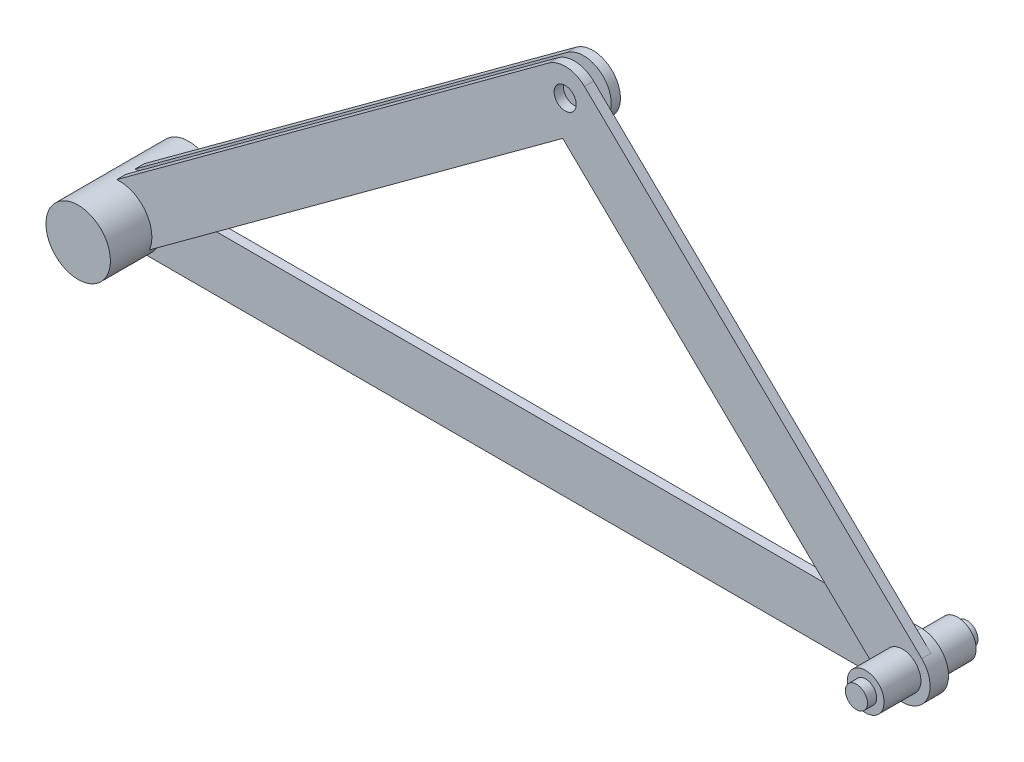
ISO-10303-21;
HEADER;
FILE_DESCRIPTION(('STEP AP214'),'2;1');
FILE_NAME('part.step','',(''),(''),'','','');
FILE_SCHEMA(('AUTOMOTIVE_DESIGN { 1 0 10303 214 1 1 1 1 }'));
ENDSEC;
DATA;
#1=APPLICATION_CONTEXT('core data for automotive mechanical design processes');
#2=APPLICATION_PROTOCOL_DEFINITION('international standard','automotive_design',2000,#1);
#3=PRODUCT_CONTEXT('',#1,'mechanical');
#4=PRODUCT('Part','Part','',(#3));
#5=PRODUCT_RELATED_PRODUCT_CATEGORY('part','',(#4));
#6=PRODUCT_DEFINITION_FORMATION('','',#4);
#7=PRODUCT_DEFINITION_CONTEXT('part definition',#1,'design');
#8=PRODUCT_DEFINITION('design','',#6,#7);
#9=PRODUCT_DEFINITION_SHAPE('','',#8);
#10=(LENGTH_UNIT() NAMED_UNIT(*) SI_UNIT(.MILLI.,.METRE.));
#11=(NAMED_UNIT(*) PLANE_ANGLE_UNIT() SI_UNIT($,.RADIAN.));
#12=(NAMED_UNIT(*) SI_UNIT($,.STERADIAN.) SOLID_ANGLE_UNIT());
#13=UNCERTAINTY_MEASURE_WITH_UNIT(LENGTH_MEASURE(1.E-05),#10,'distance_accuracy_value','');
#14=(GEOMETRIC_REPRESENTATION_CONTEXT(3) GLOBAL_UNCERTAINTY_ASSIGNED_CONTEXT((#13)) GLOBAL_UNIT_ASSIGNED_CONTEXT((#10,
#11,#12)) REPRESENTATION_CONTEXT('',''));
#15=CARTESIAN_POINT('',(0.,0.,0.));
#16=DIRECTION('',(0.,0.,1.));
#17=DIRECTION('',(1.,0.,0.));
#18=AXIS2_PLACEMENT_3D('',#15,#16,#17);
#19=CARTESIAN_POINT('',(0.,0.,5.));
#20=DIRECTION('',(0.,0.,1.));
#21=DIRECTION('',(1.,0.,0.));
#22=AXIS2_PLACEMENT_3D('',#19,#20,#21);
#23=PLANE('',#22);
#24=CARTESIAN_POINT('',(-215.,0.,5.));
#25=DIRECTION('',(0.,0.,1.));
#26=DIRECTION('',(1.,0.,0.));
#27=AXIS2_PLACEMENT_3D('',#24,#25,#26);
#28=CIRCLE('',#27,17.5);
#29=CARTESIAN_POINT('',(-205.98612181134,-15.,5.));
#30=VERTEX_POINT('',#29);
#31=CARTESIAN_POINT('',(-198.859216412014,-6.76203409972145,5.));
#32=VERTEX_POINT('',#31);
#33=EDGE_CURVE('E57',#30,#32,#28,.T.);
#34=ORIENTED_EDGE('',*,*,#33,.F.);
#35=DIRECTION('',(1.,0.,0.));
#36=VECTOR('',#35,1.);
#37=CARTESIAN_POINT('',(-225.,-15.,5.));
#38=LINE('',#37,#36);
#39=CARTESIAN_POINT('',(210.,-15.,5.));
#40=VERTEX_POINT('',#39);
#41=EDGE_CURVE('E315',#30,#40,#38,.T.);
#42=ORIENTED_EDGE('',*,*,#41,.T.);
#43=CARTESIAN_POINT('',(210.,0.,5.));
#44=DIRECTION('',(0.,0.,1.));
#45=DIRECTION('',(1.,0.,0.));
#46=AXIS2_PLACEMENT_3D('',#43,#44,#45);
#47=CIRCLE('',#46,15.);
#48=CARTESIAN_POINT('',(199.561031329421,-10.7716262975779,5.));
#49=VERTEX_POINT('',#48);
#50=EDGE_CURVE('E271',#49,#40,#47,.T.);
#51=ORIENTED_EDGE('',*,*,#50,.F.);
#52=DIRECTION('',(0.718108419838523,-0.695931244705265,0.));
#53=VECTOR('',#52,1.);
#54=CARTESIAN_POINT('',(199.561031329421,-10.7716262975779,5.));
#55=LINE('',#54,#53);
#56=CARTESIAN_POINT('',(172.968143054861,15.,5.));
#57=VERTEX_POINT('',#56);
#58=EDGE_CURVE('E292',#57,#49,#55,.T.);
#59=ORIENTED_EDGE('',*,*,#58,.F.);
#60=DIRECTION('',(-1.,0.,0.));
#61=VECTOR('',#60,1.);
#62=CARTESIAN_POINT('',(-225.,15.,5.));
#63=LINE('',#62,#61);
#64=CARTESIAN_POINT('',(-169.19744009417,15.,5.));
#65=VERTEX_POINT('',#64);
#66=EDGE_CURVE('E316',#57,#65,#63,.T.);
#67=ORIENTED_EDGE('',*,*,#66,.T.);
#68=DIRECTION('',(0.806274509803921,0.591541557999475,0.));
#69=VECTOR('',#68,1.);
#70=CARTESIAN_POINT('',(-206.126876630008,-12.0941176470588,5.));
#71=LINE('',#70,#69);
#72=EDGE_CURVE('E258',#32,#65,#71,.T.);
#73=ORIENTED_EDGE('',*,*,#72,.F.);
#74=EDGE_LOOP('',(#34,#42,#51,#59,#67,#73));
#75=FACE_BOUND('',#74,.T.);
#76=ADVANCED_FACE('F40',(#75),#23,.T.);
#77=CARTESIAN_POINT('',(26.8823529411766,177.462467399842,10.));
#78=DIRECTION('',(0.,0.,-1.));
#79=DIRECTION('',(-1.,0.,0.));
#80=AXIS2_PLACEMENT_3D('',#77,#78,#79);
#81=CYLINDRICAL_SURFACE('',#80,15.);
#82=DIRECTION('',(0.,0.,-1.));
#83=VECTOR('',#82,1.);
#84=CARTESIAN_POINT('',(18.0092295711844,189.556585046901,10.));
#85=LINE('',#84,#83);
#86=CARTESIAN_POINT('',(18.0092295711844,189.556585046901,10.));
#87=VERTEX_POINT('',#86);
#88=CARTESIAN_POINT('',(18.0092295711844,189.556585046901,5.));
#89=VERTEX_POINT('',#88);
#90=EDGE_CURVE('E257',#87,#89,#85,.T.);
#91=ORIENTED_EDGE('',*,*,#90,.F.);
#92=CARTESIAN_POINT('',(26.8823529411766,177.462467399842,10.));
#93=DIRECTION('',(0.,0.,1.));
#94=DIRECTION('',(1.,0.,0.));
#95=AXIS2_PLACEMENT_3D('',#92,#93,#94);
#96=CIRCLE('',#95,15.);
#97=CARTESIAN_POINT('',(37.3213216117556,188.23409369742,10.));
#98=VERTEX_POINT('',#97);
#99=EDGE_CURVE('E280',#98,#87,#96,.T.);
#100=ORIENTED_EDGE('',*,*,#99,.F.);
#101=DIRECTION('',(0.,0.,-1.));
#102=VECTOR('',#101,1.);
#103=CARTESIAN_POINT('',(37.3213216117556,188.23409369742,10.));
#104=LINE('',#103,#102);
#105=CARTESIAN_POINT('',(37.3213216117556,188.23409369742,5.));
#106=VERTEX_POINT('',#105);
#107=EDGE_CURVE('E296',#98,#106,#104,.T.);
#108=ORIENTED_EDGE('',*,*,#107,.T.);
#109=CARTESIAN_POINT('',(26.8823529411766,177.462467399842,5.));
#110=DIRECTION('',(0.,0.,1.));
#111=DIRECTION('',(1.,0.,0.));
#112=AXIS2_PLACEMENT_3D('',#109,#110,#111);
#113=CIRCLE('',#112,15.);
#114=EDGE_CURVE('E290',#106,#89,#113,.T.);
#115=ORIENTED_EDGE('',*,*,#114,.T.);
#116=EDGE_LOOP('',(#91,#100,#108,#115));
#117=FACE_BOUND('',#116,.T.);
#118=ADVANCED_FACE('F380',(#117),#81,.T.);
#119=CARTESIAN_POINT('',(199.561031329421,-10.7716262975779,10.));
#120=DIRECTION('',(0.695931244705265,0.718108419838523,0.));
#121=DIRECTION('',(-0.718108419838523,0.695931244705265,0.));
#122=AXIS2_PLACEMENT_3D('',#119,#120,#121);
#123=PLANE('',#122);
#124=DIRECTION('',(0.,0.,1.));
#125=VECTOR('',#124,1.);
#126=CARTESIAN_POINT('',(25.5409513118945,157.874232105725,10.));
#127=LINE('',#126,#125);
#128=CARTESIAN_POINT('',(25.5409513118945,157.874232105725,5.));
#129=VERTEX_POINT('',#128);
#130=CARTESIAN_POINT('',(25.5409513118945,157.874232105725,10.));
#131=VERTEX_POINT('',#130);
#132=EDGE_CURVE('E340',#129,#131,#127,.T.);
#133=ORIENTED_EDGE('',*,*,#132,.F.);
#134=EDGE_CURVE('E278',#129,#57,#55,.T.);
#135=ORIENTED_EDGE('',*,*,#134,.T.);
#136=ORIENTED_EDGE('',*,*,#58,.T.);
#137=DIRECTION('',(0.,0.,-1.));
#138=VECTOR('',#137,1.);
#139=CARTESIAN_POINT('',(199.561031329421,-10.7716262975779,10.));
#140=LINE('',#139,#138);
#141=CARTESIAN_POINT('',(199.561031329421,-10.7716262975779,10.));
#142=VERTEX_POINT('',#141);
#143=EDGE_CURVE('E285',#142,#49,#140,.T.);
#144=ORIENTED_EDGE('',*,*,#143,.F.);
#145=DIRECTION('',(0.718108419838523,-0.695931244705265,0.));
#146=VECTOR('',#145,1.);
#147=CARTESIAN_POINT('',(199.561031329421,-10.7716262975779,10.));
#148=LINE('',#147,#146);
#149=EDGE_CURVE('E283',#131,#142,#148,.T.);
#150=ORIENTED_EDGE('',*,*,#149,.F.);
#151=EDGE_LOOP('',(#133,#135,#136,#144,#150));
#152=FACE_BOUND('',#151,.T.);
#153=ADVANCED_FACE('F386',(#152),#123,.F.);
#154=CARTESIAN_POINT('',(210.,0.,5.));
#155=DIRECTION('',(0.,0.,-1.));
#156=DIRECTION('',(-1.,0.,0.));
#157=AXIS2_PLACEMENT_3D('',#154,#155,#156);
#158=CYLINDRICAL_SURFACE('',#157,15.);
#159=DIRECTION('',(0.,0.,-1.));
#160=VECTOR('',#159,1.);
#161=CARTESIAN_POINT('',(210.,15.,5.));
#162=LINE('',#161,#160);
#163=CARTESIAN_POINT('',(210.,15.,5.));
#164=VERTEX_POINT('',#163);
#165=CARTESIAN_POINT('',(210.,15.,0.));
#166=VERTEX_POINT('',#165);
#167=EDGE_CURVE('E318',#164,#166,#162,.T.);
#168=ORIENTED_EDGE('',*,*,#167,.F.);
#169=CARTESIAN_POINT('',(210.,0.,5.));
#170=DIRECTION('',(0.,0.,1.));
#171=DIRECTION('',(1.,0.,0.));
#172=AXIS2_PLACEMENT_3D('',#169,#170,#171);
#173=CIRCLE('',#172,15.);
#174=CARTESIAN_POINT('',(220.438968670579,10.7716262975779,5.));
#175=VERTEX_POINT('',#174);
#176=EDGE_CURVE('E302',#164,#175,#173,.F.);
#177=ORIENTED_EDGE('',*,*,#176,.T.);
#178=DIRECTION('',(0.,0.,-1.));
#179=VECTOR('',#178,1.);
#180=CARTESIAN_POINT('',(220.438968670579,10.7716262975779,10.));
#181=LINE('',#180,#179);
#182=CARTESIAN_POINT('',(220.438968670579,10.7716262975779,10.));
#183=VERTEX_POINT('',#182);
#184=EDGE_CURVE('E299',#183,#175,#181,.T.);
#185=ORIENTED_EDGE('',*,*,#184,.F.);
#186=CARTESIAN_POINT('',(210.,0.,10.));
#187=DIRECTION('',(0.,0.,1.));
#188=DIRECTION('',(1.,0.,0.));
#189=AXIS2_PLACEMENT_3D('',#186,#187,#188);
#190=CIRCLE('',#189,15.);
#191=EDGE_CURVE('E274',#142,#183,#190,.T.);
#192=ORIENTED_EDGE('',*,*,#191,.F.);
#193=ORIENTED_EDGE('',*,*,#143,.T.);
#194=ORIENTED_EDGE('',*,*,#50,.T.);
#195=DIRECTION('',(0.,0.,-1.));
#196=VECTOR('',#195,1.);
#197=CARTESIAN_POINT('',(210.,-15.,5.));
#198=LINE('',#197,#196);
#199=CARTESIAN_POINT('',(210.,-15.,0.));
#200=VERTEX_POINT('',#199);
#201=EDGE_CURVE('E326',#200,#40,#198,.F.);
#202=ORIENTED_EDGE('',*,*,#201,.F.);
#203=CARTESIAN_POINT('',(210.,0.,0.));
#204=DIRECTION('',(0.,0.,1.));
#205=DIRECTION('',(1.,0.,0.));
#206=AXIS2_PLACEMENT_3D('',#203,#204,#205);
#207=CIRCLE('',#206,15.);
#208=EDGE_CURVE('E329',#166,#200,#207,.F.);
#209=ORIENTED_EDGE('',*,*,#208,.F.);
#210=EDGE_LOOP('',(#168,#177,#185,#192,#193,#194,#202,#209));
#211=FACE_BOUND('',#210,.T.);
#212=ADVANCED_FACE('F43',(#211),#158,.T.);
#213=CARTESIAN_POINT('',(-225.,15.,5.));
#214=DIRECTION('',(0.,-1.,0.));
#215=DIRECTION('',(0.,0.,-1.));
#216=AXIS2_PLACEMENT_3D('',#213,#214,#215);
#217=PLANE('',#216);
#218=DIRECTION('',(1.,0.,0.));
#219=VECTOR('',#218,1.);
#220=CARTESIAN_POINT('',(-225.,15.,0.));
#221=LINE('',#220,#219);
#222=CARTESIAN_POINT('',(-205.98612181134,15.,0.));
#223=VERTEX_POINT('',#222);
#224=CARTESIAN_POINT('',(-169.19744009417,14.9999999999999,0.));
#225=VERTEX_POINT('',#224);
#226=EDGE_CURVE('E248',#223,#225,#221,.T.);
#227=ORIENTED_EDGE('',*,*,#226,.F.);
#228=DIRECTION('',(0.,0.,1.));
#229=VECTOR('',#228,1.);
#230=CARTESIAN_POINT('',(-205.98612181134,15.,-27.5));
#231=LINE('',#230,#229);
#232=CARTESIAN_POINT('',(-205.98612181134,15.,5.));
#233=VERTEX_POINT('',#232);
#234=EDGE_CURVE('E199',#223,#233,#231,.T.);
#235=ORIENTED_EDGE('',*,*,#234,.T.);
#236=DIRECTION('',(-1.,0.,0.));
#237=VECTOR('',#236,1.);
#238=CARTESIAN_POINT('',(-225.,15.,5.));
#239=LINE('',#238,#237);
#240=EDGE_CURVE('E264',#65,#233,#239,.T.);
#241=ORIENTED_EDGE('',*,*,#240,.F.);
#242=ORIENTED_EDGE('',*,*,#66,.F.);
#243=EDGE_CURVE('E312',#164,#57,#63,.T.);
#244=ORIENTED_EDGE('',*,*,#243,.F.);
#245=ORIENTED_EDGE('',*,*,#167,.T.);
#246=DIRECTION('',(-1.,0.,0.));
#247=VECTOR('',#246,1.);
#248=CARTESIAN_POINT('',(-225.,15.,0.));
#249=LINE('',#248,#247);
#250=EDGE_CURVE('E319',#166,#225,#249,.T.);
#251=ORIENTED_EDGE('',*,*,#250,.T.);
#252=EDGE_LOOP('',(#227,#235,#241,#242,#244,#245,#251));
#253=FACE_BOUND('',#252,.T.);
#254=ADVANCED_FACE('F391',(#253),#217,.F.);
#255=CARTESIAN_POINT('',(-225.,-15.,5.));
#256=DIRECTION('',(0.,1.,0.));
#257=DIRECTION('',(0.,0.,1.));
#258=AXIS2_PLACEMENT_3D('',#255,#256,#257);
#259=PLANE('',#258);
#260=ORIENTED_EDGE('',*,*,#41,.F.);
#261=DIRECTION('',(0.,0.,1.));
#262=VECTOR('',#261,1.);
#263=CARTESIAN_POINT('',(-205.98612181134,-15.,-27.5));
#264=LINE('',#263,#262);
#265=CARTESIAN_POINT('',(-205.98612181134,-15.,0.));
#266=VERTEX_POINT('',#265);
#267=EDGE_CURVE('E64',#30,#266,#264,.F.);
#268=ORIENTED_EDGE('',*,*,#267,.T.);
#269=DIRECTION('',(1.,0.,0.));
#270=VECTOR('',#269,1.);
#271=CARTESIAN_POINT('',(-225.,-15.,0.));
#272=LINE('',#271,#270);
#273=EDGE_CURVE('E322',#266,#200,#272,.T.);
#274=ORIENTED_EDGE('',*,*,#273,.T.);
#275=ORIENTED_EDGE('',*,*,#201,.T.);
#276=EDGE_LOOP('',(#260,#268,#274,#275));
#277=FACE_BOUND('',#276,.T.);
#278=ADVANCED_FACE('F370',(#277),#259,.F.);
#279=CARTESIAN_POINT('',(0.,0.,0.));
#280=DIRECTION('',(0.,0.,1.));
#281=DIRECTION('',(1.,0.,0.));
#282=AXIS2_PLACEMENT_3D('',#279,#280,#281);
#283=PLANE('',#282);
#284=CARTESIAN_POINT('',(210.,0.,0.));
#285=DIRECTION('',(0.,0.,1.));
#286=DIRECTION('',(1.,0.,0.));
#287=AXIS2_PLACEMENT_3D('',#284,#285,#286);
#288=CIRCLE('',#287,10.);
#289=CARTESIAN_POINT('',(220.,0.,0.));
#290=VERTEX_POINT('',#289);
#291=EDGE_CURVE('E332',#290,#290,#288,.F.);
#292=ORIENTED_EDGE('',*,*,#291,.F.);
#293=EDGE_LOOP('',(#292));
#294=FACE_BOUND('',#293,.T.);
#295=ORIENTED_EDGE('',*,*,#273,.F.);
#296=CARTESIAN_POINT('',(-215.,0.,0.));
#297=DIRECTION('',(0.,0.,1.));
#298=DIRECTION('',(1.,0.,0.));
#299=AXIS2_PLACEMENT_3D('',#296,#297,#298);
#300=CIRCLE('',#299,17.5);
#301=CARTESIAN_POINT('',(-198.859216412014,-6.76203409972145,0.));
#302=VERTEX_POINT('',#301);
#303=EDGE_CURVE('E193',#266,#302,#300,.T.);
#304=ORIENTED_EDGE('',*,*,#303,.T.);
#305=DIRECTION('',(0.806274509803921,0.591541557999475,0.));
#306=VECTOR('',#305,1.);
#307=CARTESIAN_POINT('',(-206.126876630008,-12.0941176470588,0.));
#308=LINE('',#307,#306);
#309=EDGE_CURVE('E177',#302,#225,#308,.T.);
#310=ORIENTED_EDGE('',*,*,#309,.T.);
#311=ORIENTED_EDGE('',*,*,#250,.F.);
#312=ORIENTED_EDGE('',*,*,#208,.T.);
#313=EDGE_LOOP('',(#295,#304,#310,#311,#312));
#314=FACE_BOUND('',#313,.T.);
#315=ADVANCED_FACE('F357',(#294,#314),#283,.F.);
#316=CARTESIAN_POINT('',(210.,0.,22.5));
#317=DIRECTION('',(0.,0.,-1.));
#318=DIRECTION('',(-1.,0.,0.));
#319=AXIS2_PLACEMENT_3D('',#316,#317,#318);
#320=CYLINDRICAL_SURFACE('',#319,10.);
#321=ORIENTED_EDGE('',*,*,#291,.T.);
#322=EDGE_LOOP('',(#321));
#323=FACE_BOUND('',#322,.T.);
#324=CARTESIAN_POINT('',(210.,0.,-20.));
#325=DIRECTION('',(0.,0.,1.));
#326=DIRECTION('',(1.,0.,0.));
#327=AXIS2_PLACEMENT_3D('',#324,#325,#326);
#328=CIRCLE('',#327,10.);
#329=CARTESIAN_POINT('',(220.,0.,-20.));
#330=VERTEX_POINT('',#329);
#331=EDGE_CURVE('E214',#330,#330,#328,.T.);
#332=ORIENTED_EDGE('',*,*,#331,.T.);
#333=EDGE_LOOP('',(#332));
#334=FACE_BOUND('',#333,.T.);
#335=ADVANCED_FACE('F354',(#323,#334),#320,.T.);
#336=CARTESIAN_POINT('',(210.,0.,5.));
#337=DIRECTION('',(0.,0.,1.));
#338=DIRECTION('',(1.,0.,0.));
#339=AXIS2_PLACEMENT_3D('',#336,#337,#338);
#340=PLANE('',#339);
#341=ORIENTED_EDGE('',*,*,#240,.T.);
#342=CARTESIAN_POINT('',(-215.,0.,5.));
#343=DIRECTION('',(0.,0.,1.));
#344=DIRECTION('',(1.,0.,0.));
#345=AXIS2_PLACEMENT_3D('',#342,#343,#344);
#346=CIRCLE('',#345,17.5);
#347=CARTESIAN_POINT('',(-216.605463151998,17.4262011943962,5.));
#348=VERTEX_POINT('',#347);
#349=EDGE_CURVE('E207',#233,#348,#346,.T.);
#350=ORIENTED_EDGE('',*,*,#349,.T.);
#351=DIRECTION('',(-0.806274509803921,-0.591541557999475,0.));
#352=VECTOR('',#351,1.);
#353=CARTESIAN_POINT('',(-223.873123369992,12.0941176470588,5.));
#354=LINE('',#353,#352);
#355=EDGE_CURVE('E254',#89,#348,#354,.T.);
#356=ORIENTED_EDGE('',*,*,#355,.F.);
#357=ORIENTED_EDGE('',*,*,#114,.F.);
#358=DIRECTION('',(-0.718108419838523,0.695931244705265,0.));
#359=VECTOR('',#358,1.);
#360=CARTESIAN_POINT('',(220.438968670579,10.7716262975779,5.));
#361=LINE('',#360,#359);
#362=EDGE_CURVE('E288',#175,#106,#361,.T.);
#363=ORIENTED_EDGE('',*,*,#362,.F.);
#364=ORIENTED_EDGE('',*,*,#176,.F.);
#365=ORIENTED_EDGE('',*,*,#243,.T.);
#366=ORIENTED_EDGE('',*,*,#134,.F.);
#367=EDGE_CURVE('E250',#65,#129,#71,.T.);
#368=ORIENTED_EDGE('',*,*,#367,.F.);
#369=EDGE_LOOP('',(#341,#350,#356,#357,#363,#364,#365,#366,#368));
#370=FACE_BOUND('',#369,.T.);
#371=CARTESIAN_POINT('',(26.8823529411766,177.462467399842,5.));
#372=DIRECTION('',(0.,0.,1.));
#373=DIRECTION('',(1.,0.,0.));
#374=AXIS2_PLACEMENT_3D('',#371,#372,#373);
#375=CIRCLE('',#374,6.);
#376=CARTESIAN_POINT('',(32.8823529411766,177.462467399842,5.));
#377=VERTEX_POINT('',#376);
#378=EDGE_CURVE('E267',#377,#377,#375,.T.);
#379=ORIENTED_EDGE('',*,*,#378,.T.);
#380=EDGE_LOOP('',(#379));
#381=FACE_BOUND('',#380,.T.);
#382=ADVANCED_FACE('F356',(#370,#381),#340,.F.);
#383=CARTESIAN_POINT('',(210.,0.,10.));
#384=DIRECTION('',(0.,0.,1.));
#385=DIRECTION('',(1.,0.,0.));
#386=AXIS2_PLACEMENT_3D('',#383,#384,#385);
#387=PLANE('',#386);
#388=CARTESIAN_POINT('',(-215.,0.,10.));
#389=DIRECTION('',(0.,0.,1.));
#390=DIRECTION('',(1.,0.,0.));
#391=AXIS2_PLACEMENT_3D('',#388,#389,#390);
#392=CIRCLE('',#391,17.5);
#393=CARTESIAN_POINT('',(-198.859216412014,-6.76203409972145,10.));
#394=VERTEX_POINT('',#393);
#395=CARTESIAN_POINT('',(-216.605463151998,17.4262011943962,10.));
#396=VERTEX_POINT('',#395);
#397=EDGE_CURVE('E204',#394,#396,#392,.T.);
#398=ORIENTED_EDGE('',*,*,#397,.F.);
#399=DIRECTION('',(0.806274509803921,0.591541557999475,0.));
#400=VECTOR('',#399,1.);
#401=CARTESIAN_POINT('',(-206.126876630008,-12.0941176470588,10.));
#402=LINE('',#401,#400);
#403=EDGE_CURVE('E251',#394,#131,#402,.T.);
#404=ORIENTED_EDGE('',*,*,#403,.T.);
#405=ORIENTED_EDGE('',*,*,#149,.T.);
#406=ORIENTED_EDGE('',*,*,#191,.T.);
#407=DIRECTION('',(-0.718108419838523,0.695931244705265,0.));
#408=VECTOR('',#407,1.);
#409=CARTESIAN_POINT('',(220.438968670579,10.7716262975779,10.));
#410=LINE('',#409,#408);
#411=EDGE_CURVE('E277',#183,#98,#410,.T.);
#412=ORIENTED_EDGE('',*,*,#411,.T.);
#413=ORIENTED_EDGE('',*,*,#99,.T.);
#414=DIRECTION('',(-0.806274509803921,-0.591541557999475,0.));
#415=VECTOR('',#414,1.);
#416=CARTESIAN_POINT('',(-223.873123369992,12.0941176470588,10.));
#417=LINE('',#416,#415);
#418=EDGE_CURVE('E253',#87,#396,#417,.T.);
#419=ORIENTED_EDGE('',*,*,#418,.T.);
#420=EDGE_LOOP('',(#398,#404,#405,#406,#412,#413,#419));
#421=FACE_BOUND('',#420,.T.);
#422=CARTESIAN_POINT('',(26.8823529411766,177.462467399842,10.));
#423=DIRECTION('',(0.,0.,1.));
#424=DIRECTION('',(1.,0.,0.));
#425=AXIS2_PLACEMENT_3D('',#422,#423,#424);
#426=CIRCLE('',#425,6.);
#427=CARTESIAN_POINT('',(32.8823529411766,177.462467399842,10.));
#428=VERTEX_POINT('',#427);
#429=EDGE_CURVE('E268',#428,#428,#426,.T.);
#430=ORIENTED_EDGE('',*,*,#429,.F.);
#431=EDGE_LOOP('',(#430));
#432=FACE_BOUND('',#431,.T.);
#433=CARTESIAN_POINT('',(210.,0.,10.));
#434=DIRECTION('',(0.,0.,1.));
#435=DIRECTION('',(1.,0.,0.));
#436=AXIS2_PLACEMENT_3D('',#433,#434,#435);
#437=CIRCLE('',#436,10.);
#438=CARTESIAN_POINT('',(220.,0.,10.));
#439=VERTEX_POINT('',#438);
#440=EDGE_CURVE('E305',#439,#439,#437,.T.);
#441=ORIENTED_EDGE('',*,*,#440,.F.);
#442=EDGE_LOOP('',(#441));
#443=FACE_BOUND('',#442,.T.);
#444=ADVANCED_FACE('F366',(#421,#432,#443),#387,.T.);
#445=CARTESIAN_POINT('',(220.438968670579,10.7716262975779,10.));
#446=DIRECTION('',(-0.695931244705265,-0.718108419838523,0.));
#447=DIRECTION('',(0.718108419838523,-0.695931244705265,0.));
#448=AXIS2_PLACEMENT_3D('',#445,#446,#447);
#449=PLANE('',#448);
#450=ORIENTED_EDGE('',*,*,#362,.T.);
#451=ORIENTED_EDGE('',*,*,#107,.F.);
#452=ORIENTED_EDGE('',*,*,#411,.F.);
#453=ORIENTED_EDGE('',*,*,#184,.T.);
#454=EDGE_LOOP('',(#450,#451,#452,#453));
#455=FACE_BOUND('',#454,.T.);
#456=ADVANCED_FACE('F416',(#455),#449,.F.);
#457=CARTESIAN_POINT('',(26.8823529411766,177.462467399842,10.));
#458=DIRECTION('',(0.,0.,-1.));
#459=DIRECTION('',(-1.,0.,0.));
#460=AXIS2_PLACEMENT_3D('',#457,#458,#459);
#461=CYLINDRICAL_SURFACE('',#460,6.);
#462=ORIENTED_EDGE('',*,*,#429,.T.);
#463=EDGE_LOOP('',(#462));
#464=FACE_BOUND('',#463,.T.);
#465=ORIENTED_EDGE('',*,*,#378,.F.);
#466=EDGE_LOOP('',(#465));
#467=FACE_BOUND('',#466,.T.);
#468=ADVANCED_FACE('F377',(#464,#467),#461,.F.);
#469=ORIENTED_EDGE('',*,*,#440,.T.);
#470=EDGE_LOOP('',(#469));
#471=FACE_BOUND('',#470,.T.);
#472=CARTESIAN_POINT('',(210.,0.,30.));
#473=DIRECTION('',(0.,0.,1.));
#474=DIRECTION('',(1.,0.,0.));
#475=AXIS2_PLACEMENT_3D('',#472,#473,#474);
#476=CIRCLE('',#475,10.);
#477=CARTESIAN_POINT('',(220.,0.,30.));
#478=VERTEX_POINT('',#477);
#479=EDGE_CURVE('E221',#478,#478,#476,.T.);
#480=ORIENTED_EDGE('',*,*,#479,.F.);
#481=EDGE_LOOP('',(#480));
#482=FACE_BOUND('',#481,.T.);
#483=ADVANCED_FACE('F360',(#471,#482),#320,.T.);
#484=CARTESIAN_POINT('',(-206.126876630008,-12.0941176470588,10.));
#485=DIRECTION('',(-0.591541557999475,0.806274509803921,0.));
#486=DIRECTION('',(-0.806274509803922,-0.591541557999475,0.));
#487=AXIS2_PLACEMENT_3D('',#484,#485,#486);
#488=PLANE('',#487);
#489=ORIENTED_EDGE('',*,*,#403,.F.);
#490=DIRECTION('',(0.,0.,1.));
#491=VECTOR('',#490,1.);
#492=CARTESIAN_POINT('',(-198.859216412014,-6.76203409972145,-27.5));
#493=LINE('',#492,#491);
#494=EDGE_CURVE('E202',#394,#32,#493,.F.);
#495=ORIENTED_EDGE('',*,*,#494,.T.);
#496=ORIENTED_EDGE('',*,*,#72,.T.);
#497=ORIENTED_EDGE('',*,*,#367,.T.);
#498=ORIENTED_EDGE('',*,*,#132,.T.);
#499=EDGE_LOOP('',(#489,#495,#496,#497,#498));
#500=FACE_BOUND('',#499,.T.);
#501=ADVANCED_FACE('F376',(#500),#488,.F.);
#502=CARTESIAN_POINT('',(-223.873123369992,12.0941176470588,10.));
#503=DIRECTION('',(0.591541557999475,-0.806274509803921,0.));
#504=DIRECTION('',(0.806274509803921,0.591541557999475,0.));
#505=AXIS2_PLACEMENT_3D('',#502,#503,#504);
#506=PLANE('',#505);
#507=ORIENTED_EDGE('',*,*,#355,.T.);
#508=DIRECTION('',(0.,0.,1.));
#509=VECTOR('',#508,1.);
#510=CARTESIAN_POINT('',(-216.605463151998,17.4262011943962,-27.5));
#511=LINE('',#510,#509);
#512=EDGE_CURVE('E209',#348,#396,#511,.T.);
#513=ORIENTED_EDGE('',*,*,#512,.T.);
#514=ORIENTED_EDGE('',*,*,#418,.F.);
#515=ORIENTED_EDGE('',*,*,#90,.T.);
#516=EDGE_LOOP('',(#507,#513,#514,#515));
#517=FACE_BOUND('',#516,.T.);
#518=ADVANCED_FACE('F407',(#517),#506,.F.);
#519=CARTESIAN_POINT('',(-215.,0.,0.));
#520=DIRECTION('',(0.,0.,-1.));
#521=DIRECTION('',(1.,0.,0.));
#522=AXIS2_PLACEMENT_3D('',#519,#520,#521);
#523=PLANE('',#522);
#524=CARTESIAN_POINT('',(26.8823529411766,177.462467399842,0.));
#525=DIRECTION('',(0.,0.,1.));
#526=DIRECTION('',(1.,0.,0.));
#527=AXIS2_PLACEMENT_3D('',#524,#525,#526);
#528=CIRCLE('',#527,6.);
#529=CARTESIAN_POINT('',(32.8823529411766,177.462467399842,0.));
#530=VERTEX_POINT('',#529);
#531=EDGE_CURVE('E229',#530,#530,#528,.T.);
#532=ORIENTED_EDGE('',*,*,#531,.F.);
#533=EDGE_LOOP('',(#532));
#534=FACE_BOUND('',#533,.T.);
#535=DIRECTION('',(-0.806274509803921,-0.591541557999475,0.));
#536=VECTOR('',#535,1.);
#537=CARTESIAN_POINT('',(-223.873123369992,12.0941176470588,0.));
#538=LINE('',#537,#536);
#539=CARTESIAN_POINT('',(18.0092295711844,189.556585046901,0.));
#540=VERTEX_POINT('',#539);
#541=CARTESIAN_POINT('',(-216.605463151998,17.4262011943962,0.));
#542=VERTEX_POINT('',#541);
#543=EDGE_CURVE('E233',#540,#542,#538,.T.);
#544=ORIENTED_EDGE('',*,*,#543,.T.);
#545=CARTESIAN_POINT('',(-215.,0.,0.));
#546=DIRECTION('',(0.,0.,-1.));
#547=DIRECTION('',(-1.,0.,0.));
#548=AXIS2_PLACEMENT_3D('',#545,#546,#547);
#549=CIRCLE('',#548,17.5);
#550=EDGE_CURVE('E188',#542,#223,#549,.T.);
#551=ORIENTED_EDGE('',*,*,#550,.T.);
#552=ORIENTED_EDGE('',*,*,#226,.T.);
#553=CARTESIAN_POINT('',(35.7554763111687,165.368349752784,0.));
#554=VERTEX_POINT('',#553);
#555=EDGE_CURVE('E243',#225,#554,#308,.T.);
#556=ORIENTED_EDGE('',*,*,#555,.T.);
#557=CARTESIAN_POINT('',(26.8823529411766,177.462467399842,0.));
#558=DIRECTION('',(0.,0.,1.));
#559=DIRECTION('',(1.,0.,0.));
#560=AXIS2_PLACEMENT_3D('',#557,#558,#559);
#561=CIRCLE('',#560,15.);
#562=EDGE_CURVE('E240',#554,#540,#561,.T.);
#563=ORIENTED_EDGE('',*,*,#562,.T.);
#564=EDGE_LOOP('',(#544,#551,#552,#556,#563));
#565=FACE_BOUND('',#564,.T.);
#566=ADVANCED_FACE('F431',(#534,#565),#523,.F.);
#567=CARTESIAN_POINT('',(-223.873123369992,12.0941176470588,-5.));
#568=DIRECTION('',(-0.591541557999475,0.806274509803921,0.));
#569=DIRECTION('',(-0.806274509803921,-0.591541557999475,0.));
#570=AXIS2_PLACEMENT_3D('',#567,#568,#569);
#571=PLANE('',#570);
#572=DIRECTION('',(0.,0.,1.));
#573=VECTOR('',#572,1.);
#574=CARTESIAN_POINT('',(-216.605463151998,17.4262011943962,-27.5));
#575=LINE('',#574,#573);
#576=CARTESIAN_POINT('',(-216.605463151998,17.4262011943962,-5.));
#577=VERTEX_POINT('',#576);
#578=EDGE_CURVE('E180',#542,#577,#575,.F.);
#579=ORIENTED_EDGE('',*,*,#578,.F.);
#580=ORIENTED_EDGE('',*,*,#543,.F.);
#581=DIRECTION('',(0.,0.,1.));
#582=VECTOR('',#581,1.);
#583=CARTESIAN_POINT('',(18.0092295711844,189.556585046901,-5.));
#584=LINE('',#583,#582);
#585=CARTESIAN_POINT('',(18.0092295711844,189.556585046901,-5.));
#586=VERTEX_POINT('',#585);
#587=EDGE_CURVE('E246',#586,#540,#584,.T.);
#588=ORIENTED_EDGE('',*,*,#587,.F.);
#589=DIRECTION('',(-0.806274509803921,-0.591541557999475,0.));
#590=VECTOR('',#589,1.);
#591=CARTESIAN_POINT('',(-223.873123369992,12.0941176470588,-5.));
#592=LINE('',#591,#590);
#593=EDGE_CURVE('E236',#586,#577,#592,.T.);
#594=ORIENTED_EDGE('',*,*,#593,.T.);
#595=EDGE_LOOP('',(#579,#580,#588,#594));
#596=FACE_BOUND('',#595,.T.);
#597=ADVANCED_FACE('F434',(#596),#571,.T.);
#598=CARTESIAN_POINT('',(26.8823529411766,177.462467399842,-5.));
#599=DIRECTION('',(0.,0.,1.));
#600=DIRECTION('',(1.,0.,0.));
#601=AXIS2_PLACEMENT_3D('',#598,#599,#600);
#602=CYLINDRICAL_SURFACE('',#601,15.);
#603=ORIENTED_EDGE('',*,*,#562,.F.);
#604=DIRECTION('',(0.,0.,1.));
#605=VECTOR('',#604,1.);
#606=CARTESIAN_POINT('',(35.7554763111687,165.368349752784,-5.));
#607=LINE('',#606,#605);
#608=CARTESIAN_POINT('',(35.7554763111687,165.368349752784,-5.));
#609=VERTEX_POINT('',#608);
#610=EDGE_CURVE('E169',#609,#554,#607,.T.);
#611=ORIENTED_EDGE('',*,*,#610,.F.);
#612=CARTESIAN_POINT('',(26.8823529411766,177.462467399842,-5.));
#613=DIRECTION('',(0.,0.,1.));
#614=DIRECTION('',(1.,0.,0.));
#615=AXIS2_PLACEMENT_3D('',#612,#613,#614);
#616=CIRCLE('',#615,15.);
#617=EDGE_CURVE('E165',#609,#586,#616,.T.);
#618=ORIENTED_EDGE('',*,*,#617,.T.);
#619=ORIENTED_EDGE('',*,*,#587,.T.);
#620=EDGE_LOOP('',(#603,#611,#618,#619));
#621=FACE_BOUND('',#620,.T.);
#622=ADVANCED_FACE('F433',(#621),#602,.T.);
#623=CARTESIAN_POINT('',(-206.126876630008,-12.0941176470588,-5.));
#624=DIRECTION('',(0.591541557999475,-0.806274509803921,0.));
#625=DIRECTION('',(0.806274509803922,0.591541557999475,0.));
#626=AXIS2_PLACEMENT_3D('',#623,#624,#625);
#627=PLANE('',#626);
#628=DIRECTION('',(0.,0.,1.));
#629=VECTOR('',#628,1.);
#630=CARTESIAN_POINT('',(-198.859216412014,-6.76203409972145,-27.5));
#631=LINE('',#630,#629);
#632=CARTESIAN_POINT('',(-198.859216412014,-6.76203409972145,-5.));
#633=VERTEX_POINT('',#632);
#634=EDGE_CURVE('E173',#633,#302,#631,.T.);
#635=ORIENTED_EDGE('',*,*,#634,.F.);
#636=DIRECTION('',(0.806274509803921,0.591541557999475,0.));
#637=VECTOR('',#636,1.);
#638=CARTESIAN_POINT('',(-206.126876630008,-12.0941176470588,-5.));
#639=LINE('',#638,#637);
#640=EDGE_CURVE('E158',#633,#609,#639,.T.);
#641=ORIENTED_EDGE('',*,*,#640,.T.);
#642=ORIENTED_EDGE('',*,*,#610,.T.);
#643=ORIENTED_EDGE('',*,*,#555,.F.);
#644=ORIENTED_EDGE('',*,*,#309,.F.);
#645=EDGE_LOOP('',(#635,#641,#642,#643,#644));
#646=FACE_BOUND('',#645,.T.);
#647=ADVANCED_FACE('F174',(#646),#627,.T.);
#648=CARTESIAN_POINT('',(-215.,0.,-5.));
#649=DIRECTION('',(0.,0.,-1.));
#650=DIRECTION('',(1.,0.,0.));
#651=AXIS2_PLACEMENT_3D('',#648,#649,#650);
#652=PLANE('',#651);
#653=CARTESIAN_POINT('',(-215.,0.,-5.));
#654=DIRECTION('',(0.,0.,-1.));
#655=DIRECTION('',(-1.,0.,0.));
#656=AXIS2_PLACEMENT_3D('',#653,#654,#655);
#657=CIRCLE('',#656,17.5);
#658=EDGE_CURVE('E11',#577,#633,#657,.T.);
#659=ORIENTED_EDGE('',*,*,#658,.F.);
#660=ORIENTED_EDGE('',*,*,#593,.F.);
#661=ORIENTED_EDGE('',*,*,#617,.F.);
#662=ORIENTED_EDGE('',*,*,#640,.F.);
#663=EDGE_LOOP('',(#659,#660,#661,#662));
#664=FACE_BOUND('',#663,.T.);
#665=CARTESIAN_POINT('',(26.8823529411766,177.462467399842,-5.));
#666=DIRECTION('',(0.,0.,1.));
#667=DIRECTION('',(1.,0.,0.));
#668=AXIS2_PLACEMENT_3D('',#665,#666,#667);
#669=CIRCLE('',#668,6.);
#670=CARTESIAN_POINT('',(32.8823529411766,177.462467399842,-5.));
#671=VERTEX_POINT('',#670);
#672=EDGE_CURVE('E230',#671,#671,#669,.T.);
#673=ORIENTED_EDGE('',*,*,#672,.T.);
#674=EDGE_LOOP('',(#673));
#675=FACE_BOUND('',#674,.T.);
#676=ADVANCED_FACE('F160',(#664,#675),#652,.T.);
#677=CARTESIAN_POINT('',(26.8823529411766,177.462467399842,-5.));
#678=DIRECTION('',(0.,0.,1.));
#679=DIRECTION('',(1.,0.,0.));
#680=AXIS2_PLACEMENT_3D('',#677,#678,#679);
#681=CYLINDRICAL_SURFACE('',#680,6.);
#682=ORIENTED_EDGE('',*,*,#672,.F.);
#683=EDGE_LOOP('',(#682));
#684=FACE_BOUND('',#683,.T.);
#685=ORIENTED_EDGE('',*,*,#531,.T.);
#686=EDGE_LOOP('',(#685));
#687=FACE_BOUND('',#686,.T.);
#688=ADVANCED_FACE('F500',(#684,#687),#681,.F.);
#689=CARTESIAN_POINT('',(210.,0.,30.));
#690=DIRECTION('',(0.,0.,1.));
#691=DIRECTION('',(1.,0.,0.));
#692=AXIS2_PLACEMENT_3D('',#689,#690,#691);
#693=PLANE('',#692);
#694=CARTESIAN_POINT('',(210.,0.,30.));
#695=DIRECTION('',(0.,0.,1.));
#696=DIRECTION('',(1.,0.,0.));
#697=AXIS2_PLACEMENT_3D('',#694,#695,#696);
#698=CIRCLE('',#697,6.00000000000002);
#699=CARTESIAN_POINT('',(216.,0.,30.));
#700=VERTEX_POINT('',#699);
#701=EDGE_CURVE('E217',#700,#700,#698,.T.);
#702=ORIENTED_EDGE('',*,*,#701,.F.);
#703=EDGE_LOOP('',(#702));
#704=FACE_BOUND('',#703,.T.);
#705=ORIENTED_EDGE('',*,*,#479,.T.);
#706=EDGE_LOOP('',(#705));
#707=FACE_BOUND('',#706,.T.);
#708=ADVANCED_FACE('F497',(#704,#707),#693,.T.);
#709=CARTESIAN_POINT('',(210.,0.,35.));
#710=DIRECTION('',(0.,0.,-1.));
#711=DIRECTION('',(-1.,0.,0.));
#712=AXIS2_PLACEMENT_3D('',#709,#710,#711);
#713=CYLINDRICAL_SURFACE('',#712,6.00000000000002);
#714=CARTESIAN_POINT('',(210.,0.,35.));
#715=DIRECTION('',(0.,0.,1.));
#716=DIRECTION('',(1.,0.,0.));
#717=AXIS2_PLACEMENT_3D('',#714,#715,#716);
#718=CIRCLE('',#717,6.00000000000002);
#719=CARTESIAN_POINT('',(216.,0.,35.));
#720=VERTEX_POINT('',#719);
#721=EDGE_CURVE('E218',#720,#720,#718,.T.);
#722=ORIENTED_EDGE('',*,*,#721,.F.);
#723=EDGE_LOOP('',(#722));
#724=FACE_BOUND('',#723,.T.);
#725=ORIENTED_EDGE('',*,*,#701,.T.);
#726=EDGE_LOOP('',(#725));
#727=FACE_BOUND('',#726,.T.);
#728=ADVANCED_FACE('F493',(#724,#727),#713,.T.);
#729=CARTESIAN_POINT('',(210.,0.,35.));
#730=DIRECTION('',(0.,0.,1.));
#731=DIRECTION('',(1.,0.,0.));
#732=AXIS2_PLACEMENT_3D('',#729,#730,#731);
#733=PLANE('',#732);
#734=ORIENTED_EDGE('',*,*,#721,.T.);
#735=EDGE_LOOP('',(#734));
#736=FACE_BOUND('',#735,.T.);
#737=ADVANCED_FACE('F350',(#736),#733,.T.);
#738=CARTESIAN_POINT('',(210.,0.,-20.));
#739=DIRECTION('',(0.,0.,-1.));
#740=DIRECTION('',(1.,0.,0.));
#741=AXIS2_PLACEMENT_3D('',#738,#739,#740);
#742=PLANE('',#741);
#743=CARTESIAN_POINT('',(210.,0.,-20.));
#744=DIRECTION('',(0.,0.,-1.));
#745=DIRECTION('',(-1.,0.,0.));
#746=AXIS2_PLACEMENT_3D('',#743,#744,#745);
#747=CIRCLE('',#746,6.00000000000002);
#748=CARTESIAN_POINT('',(204.,0.,-20.));
#749=VERTEX_POINT('',#748);
#750=EDGE_CURVE('E50',#749,#749,#747,.T.);
#751=ORIENTED_EDGE('',*,*,#750,.F.);
#752=EDGE_LOOP('',(#751));
#753=FACE_BOUND('',#752,.T.);
#754=ORIENTED_EDGE('',*,*,#331,.F.);
#755=EDGE_LOOP('',(#754));
#756=FACE_BOUND('',#755,.T.);
#757=ADVANCED_FACE('F347',(#753,#756),#742,.T.);
#758=CARTESIAN_POINT('',(210.,0.,-25.));
#759=DIRECTION('',(0.,0.,1.));
#760=DIRECTION('',(1.,0.,0.));
#761=AXIS2_PLACEMENT_3D('',#758,#759,#760);
#762=CYLINDRICAL_SURFACE('',#761,6.00000000000002);
#763=CARTESIAN_POINT('',(210.,0.,-25.));
#764=DIRECTION('',(0.,0.,1.));
#765=DIRECTION('',(1.,0.,0.));
#766=AXIS2_PLACEMENT_3D('',#763,#764,#765);
#767=CIRCLE('',#766,6.00000000000002);
#768=CARTESIAN_POINT('',(216.,0.,-25.));
#769=VERTEX_POINT('',#768);
#770=EDGE_CURVE('E211',#769,#769,#767,.T.);
#771=ORIENTED_EDGE('',*,*,#770,.T.);
#772=EDGE_LOOP('',(#771));
#773=FACE_BOUND('',#772,.T.);
#774=ORIENTED_EDGE('',*,*,#750,.T.);
#775=EDGE_LOOP('',(#774));
#776=FACE_BOUND('',#775,.T.);
#777=ADVANCED_FACE('F345',(#773,#776),#762,.T.);
#778=CARTESIAN_POINT('',(210.,0.,-25.));
#779=DIRECTION('',(0.,0.,-1.));
#780=DIRECTION('',(1.,0.,0.));
#781=AXIS2_PLACEMENT_3D('',#778,#779,#780);
#782=PLANE('',#781);
#783=ORIENTED_EDGE('',*,*,#770,.F.);
#784=EDGE_LOOP('',(#783));
#785=FACE_BOUND('',#784,.T.);
#786=ADVANCED_FACE('F520',(#785),#782,.T.);
#787=CARTESIAN_POINT('',(-215.,0.,-27.5));
#788=DIRECTION('',(0.,0.,1.));
#789=DIRECTION('',(1.,0.,0.));
#790=AXIS2_PLACEMENT_3D('',#787,#788,#789);
#791=CYLINDRICAL_SURFACE('',#790,17.5);
#792=CARTESIAN_POINT('',(-215.,0.,32.5));
#793=DIRECTION('',(0.,0.,1.));
#794=DIRECTION('',(1.,0.,0.));
#795=AXIS2_PLACEMENT_3D('',#792,#793,#794);
#796=CIRCLE('',#795,17.5);
#797=CARTESIAN_POINT('',(-197.5,0.,32.5));
#798=VERTEX_POINT('',#797);
#799=EDGE_CURVE('E744',#798,#798,#796,.T.);
#800=ORIENTED_EDGE('',*,*,#799,.F.);
#801=EDGE_LOOP('',(#800));
#802=FACE_BOUND('',#801,.T.);
#803=CARTESIAN_POINT('',(-215.,0.,-27.5));
#804=DIRECTION('',(0.,0.,1.));
#805=DIRECTION('',(1.,0.,0.));
#806=AXIS2_PLACEMENT_3D('',#803,#804,#805);
#807=CIRCLE('',#806,17.5);
#808=CARTESIAN_POINT('',(-197.5,0.,-27.5));
#809=VERTEX_POINT('',#808);
#810=EDGE_CURVE('E181',#809,#809,#807,.T.);
#811=ORIENTED_EDGE('',*,*,#810,.T.);
#812=EDGE_LOOP('',(#811));
#813=FACE_BOUND('',#812,.T.);
#814=ORIENTED_EDGE('',*,*,#512,.F.);
#815=ORIENTED_EDGE('',*,*,#349,.F.);
#816=ORIENTED_EDGE('',*,*,#234,.F.);
#817=ORIENTED_EDGE('',*,*,#550,.F.);
#818=ORIENTED_EDGE('',*,*,#578,.T.);
#819=ORIENTED_EDGE('',*,*,#658,.T.);
#820=ORIENTED_EDGE('',*,*,#634,.T.);
#821=ORIENTED_EDGE('',*,*,#303,.F.);
#822=ORIENTED_EDGE('',*,*,#267,.F.);
#823=ORIENTED_EDGE('',*,*,#33,.T.);
#824=ORIENTED_EDGE('',*,*,#494,.F.);
#825=ORIENTED_EDGE('',*,*,#397,.T.);
#826=EDGE_LOOP('',(#814,#815,#816,#817,#818,#819,#820,#821,#822,#823,#824,#825));
#827=FACE_BOUND('',#826,.T.);
#828=ADVANCED_FACE('F185',(#802,#813,#827),#791,.T.);
#829=CARTESIAN_POINT('',(-215.,0.,-27.5));
#830=DIRECTION('',(0.,0.,1.));
#831=DIRECTION('',(1.,0.,0.));
#832=AXIS2_PLACEMENT_3D('',#829,#830,#831);
#833=PLANE('',#832);
#834=ORIENTED_EDGE('',*,*,#810,.F.);
#835=EDGE_LOOP('',(#834));
#836=FACE_BOUND('',#835,.T.);
#837=ADVANCED_FACE('F519',(#836),#833,.F.);
#838=CARTESIAN_POINT('',(-215.,0.,32.5));
#839=DIRECTION('',(0.,0.,1.));
#840=DIRECTION('',(1.,0.,0.));
#841=AXIS2_PLACEMENT_3D('',#838,#839,#840);
#842=PLANE('',#841);
#843=ORIENTED_EDGE('',*,*,#799,.T.);
#844=EDGE_LOOP('',(#843));
#845=FACE_BOUND('',#844,.T.);
#846=ADVANCED_FACE('F531',(#845),#842,.T.);
#847=CLOSED_SHELL('',(#76,#118,#153,#212,#254,#278,#315,#335,#382,#444,#456,#468,#483,#501,#518,
#566,#597,#622,#647,#676,#688,#708,#728,#737,#757,#777,#786,#828,#837,#846));
#848=CARTESIAN_POINT('',(210.,0.,-12.5));
#849=DIRECTION('',(0.,0.,-1.));
#850=DIRECTION('',(1.,0.,0.));
#851=AXIS2_PLACEMENT_3D('',#848,#849,#850);
#852=PLANE('',#851);
#853=CARTESIAN_POINT('',(210.,0.,-12.5));
#854=DIRECTION('',(0.,0.,1.));
#855=DIRECTION('',(1.,0.,0.));
#856=AXIS2_PLACEMENT_3D('',#853,#854,#855);
#857=CIRCLE('',#856,6.00000000000002);
#858=CARTESIAN_POINT('',(216.,0.,-12.5));
#859=VERTEX_POINT('',#858);
#860=EDGE_CURVE('E308',#859,#859,#857,.T.);
#861=ORIENTED_EDGE('',*,*,#860,.T.);
#862=EDGE_LOOP('',(#861));
#863=FACE_BOUND('',#862,.T.);
#864=ADVANCED_FACE('F481',(#863),#852,.F.);
#865=CARTESIAN_POINT('',(210.,0.,0.));
#866=DIRECTION('',(0.,0.,1.));
#867=DIRECTION('',(1.,0.,0.));
#868=AXIS2_PLACEMENT_3D('',#865,#866,#867);
#869=CIRCLE('',#868,6.00000000000002);
#870=CARTESIAN_POINT('',(216.,0.,0.));
#871=VERTEX_POINT('',#870);
#872=EDGE_CURVE('E311',#871,#871,#869,.F.);
#873=ORIENTED_EDGE('',*,*,#872,.T.);
#874=EDGE_LOOP('',(#873));
#875=FACE_BOUND('',#874,.T.);
#876=ADVANCED_FACE('F373',(#875),#283,.F.);
#877=CARTESIAN_POINT('',(210.,0.,22.5));
#878=DIRECTION('',(0.,0.,-1.));
#879=DIRECTION('',(-1.,0.,0.));
#880=AXIS2_PLACEMENT_3D('',#877,#878,#879);
#881=CYLINDRICAL_SURFACE('',#880,6.00000000000002);
#882=ORIENTED_EDGE('',*,*,#860,.F.);
#883=EDGE_LOOP('',(#882));
#884=FACE_BOUND('',#883,.T.);
#885=ORIENTED_EDGE('',*,*,#872,.F.);
#886=EDGE_LOOP('',(#885));
#887=FACE_BOUND('',#886,.T.);
#888=ADVANCED_FACE('F466',(#884,#887),#881,.F.);
#889=CLOSED_SHELL('',(#864,#876,#888));
#890=CARTESIAN_POINT('',(210.,0.,10.));
#891=DIRECTION('',(0.,0.,1.));
#892=DIRECTION('',(1.,0.,0.));
#893=AXIS2_PLACEMENT_3D('',#890,#891,#892);
#894=CIRCLE('',#893,6.00000000000002);
#895=CARTESIAN_POINT('',(216.,0.,10.));
#896=VERTEX_POINT('',#895);
#897=EDGE_CURVE('E337',#896,#896,#894,.T.);
#898=ORIENTED_EDGE('',*,*,#897,.T.);
#899=EDGE_LOOP('',(#898));
#900=FACE_BOUND('',#899,.T.);
#901=ADVANCED_FACE('F456',(#900),#387,.T.);
#902=ORIENTED_EDGE('',*,*,#897,.F.);
#903=EDGE_LOOP('',(#902));
#904=FACE_BOUND('',#903,.T.);
#905=CARTESIAN_POINT('',(210.,0.,22.5));
#906=DIRECTION('',(0.,0.,1.));
#907=DIRECTION('',(1.,0.,0.));
#908=AXIS2_PLACEMENT_3D('',#905,#906,#907);
#909=CIRCLE('',#908,6.00000000000002);
#910=CARTESIAN_POINT('',(216.,0.,22.5));
#911=VERTEX_POINT('',#910);
#912=EDGE_CURVE('E226',#911,#911,#909,.T.);
#913=ORIENTED_EDGE('',*,*,#912,.T.);
#914=EDGE_LOOP('',(#913));
#915=FACE_BOUND('',#914,.T.);
#916=ADVANCED_FACE('F461',(#904,#915),#881,.F.);
#917=CARTESIAN_POINT('',(210.,0.,22.5));
#918=DIRECTION('',(0.,0.,1.));
#919=DIRECTION('',(1.,0.,0.));
#920=AXIS2_PLACEMENT_3D('',#917,#918,#919);
#921=PLANE('',#920);
#922=ORIENTED_EDGE('',*,*,#912,.F.);
#923=EDGE_LOOP('',(#922));
#924=FACE_BOUND('',#923,.T.);
#925=ADVANCED_FACE('F463',(#924),#921,.F.);
#926=CLOSED_SHELL('',(#901,#916,#925));
#927=ORIENTED_CLOSED_SHELL('',*,#889,.T.);
#928=ORIENTED_CLOSED_SHELL('',*,#926,.T.);
#929=BREP_WITH_VOIDS('B2',#847,(#927,#928));
#930=ADVANCED_BREP_SHAPE_REPRESENTATION('',(#18,#929),#14);
#931=SHAPE_DEFINITION_REPRESENTATION(#9,#930);
ENDSEC;
END-ISO-10303-21;
